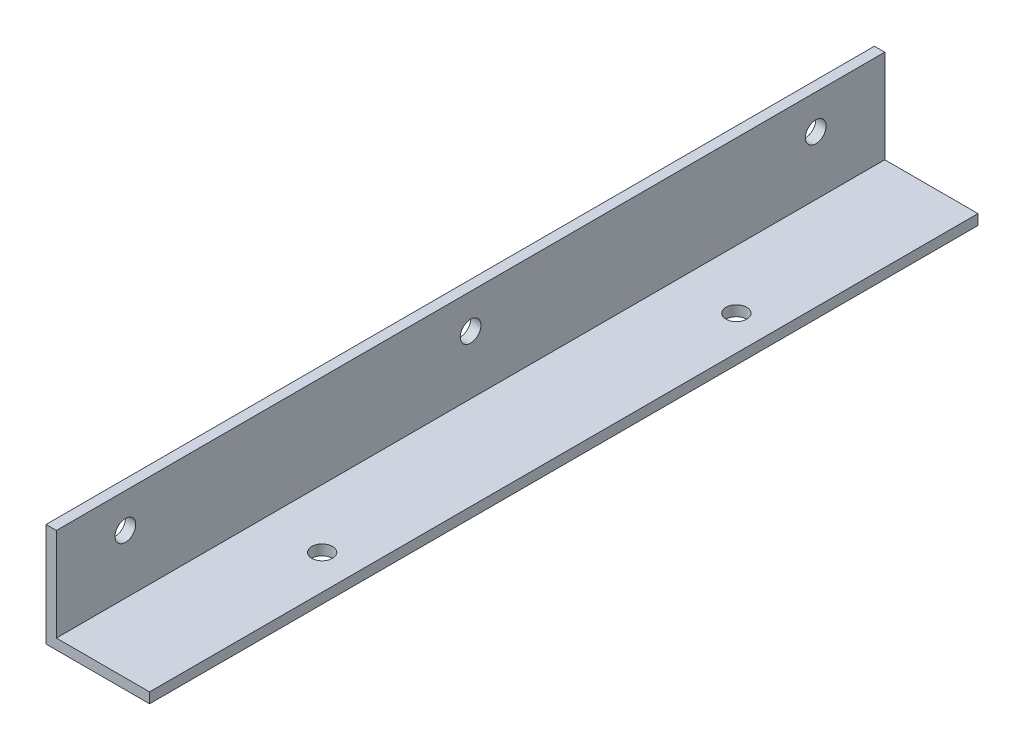
ISO-10303-21;
HEADER;
FILE_DESCRIPTION(('STEP AP214'),'2;1');
FILE_NAME('part.step','',(''),(''),'','','');
FILE_SCHEMA(('AUTOMOTIVE_DESIGN { 1 0 10303 214 1 1 1 1 }'));
ENDSEC;
DATA;
#1=APPLICATION_CONTEXT('core data for automotive mechanical design processes');
#2=APPLICATION_PROTOCOL_DEFINITION('international standard','automotive_design',2000,#1);
#3=PRODUCT_CONTEXT('',#1,'mechanical');
#4=PRODUCT('Part','Part','',(#3));
#5=PRODUCT_RELATED_PRODUCT_CATEGORY('part','',(#4));
#6=PRODUCT_DEFINITION_FORMATION('','',#4);
#7=PRODUCT_DEFINITION_CONTEXT('part definition',#1,'design');
#8=PRODUCT_DEFINITION('design','',#6,#7);
#9=PRODUCT_DEFINITION_SHAPE('','',#8);
#10=(LENGTH_UNIT() NAMED_UNIT(*) SI_UNIT(.MILLI.,.METRE.));
#11=(NAMED_UNIT(*) PLANE_ANGLE_UNIT() SI_UNIT($,.RADIAN.));
#12=(NAMED_UNIT(*) SI_UNIT($,.STERADIAN.) SOLID_ANGLE_UNIT());
#13=UNCERTAINTY_MEASURE_WITH_UNIT(LENGTH_MEASURE(1.E-05),#10,'distance_accuracy_value','');
#14=(GEOMETRIC_REPRESENTATION_CONTEXT(3) GLOBAL_UNCERTAINTY_ASSIGNED_CONTEXT((#13)) GLOBAL_UNIT_ASSIGNED_CONTEXT((#10,
#11,#12)) REPRESENTATION_CONTEXT('',''));
#15=CARTESIAN_POINT('',(0.,0.,0.));
#16=DIRECTION('',(0.,0.,1.));
#17=DIRECTION('',(1.,0.,0.));
#18=AXIS2_PLACEMENT_3D('',#15,#16,#17);
#19=CARTESIAN_POINT('',(0.,0.,120.));
#20=DIRECTION('',(1.,0.,0.));
#21=DIRECTION('',(0.,0.,-1.));
#22=AXIS2_PLACEMENT_3D('',#19,#20,#21);
#23=PLANE('',#22);
#24=CARTESIAN_POINT('',(0.,10.,110.));
#25=DIRECTION('',(-1.,0.,0.));
#26=DIRECTION('',(0.,0.,1.));
#27=AXIS2_PLACEMENT_3D('',#24,#25,#26);
#28=CIRCLE('',#27,1.5);
#29=CARTESIAN_POINT('',(0.,10.,111.5));
#30=VERTEX_POINT('',#29);
#31=EDGE_CURVE('E156',#30,#30,#28,.T.);
#32=ORIENTED_EDGE('',*,*,#31,.F.);
#33=EDGE_LOOP('',(#32));
#34=FACE_BOUND('',#33,.T.);
#35=CARTESIAN_POINT('',(0.,10.,9.99999999999999));
#36=DIRECTION('',(-1.,0.,0.));
#37=DIRECTION('',(0.,0.,1.));
#38=AXIS2_PLACEMENT_3D('',#35,#36,#37);
#39=CIRCLE('',#38,1.5);
#40=CARTESIAN_POINT('',(0.,10.,11.5));
#41=VERTEX_POINT('',#40);
#42=EDGE_CURVE('E146',#41,#41,#39,.T.);
#43=ORIENTED_EDGE('',*,*,#42,.F.);
#44=EDGE_LOOP('',(#43));
#45=FACE_BOUND('',#44,.T.);
#46=CARTESIAN_POINT('',(0.,10.,60.));
#47=DIRECTION('',(-1.,0.,0.));
#48=DIRECTION('',(0.,0.,1.));
#49=AXIS2_PLACEMENT_3D('',#46,#47,#48);
#50=CIRCLE('',#49,1.5);
#51=CARTESIAN_POINT('',(0.,10.,61.5));
#52=VERTEX_POINT('',#51);
#53=EDGE_CURVE('E136',#52,#52,#50,.T.);
#54=ORIENTED_EDGE('',*,*,#53,.F.);
#55=EDGE_LOOP('',(#54));
#56=FACE_BOUND('',#55,.T.);
#57=DIRECTION('',(0.,-1.,0.));
#58=VECTOR('',#57,1.);
#59=CARTESIAN_POINT('',(0.,0.,0.));
#60=LINE('',#59,#58);
#61=CARTESIAN_POINT('',(0.,15.,0.));
#62=VERTEX_POINT('',#61);
#63=CARTESIAN_POINT('',(0.,0.,0.));
#64=VERTEX_POINT('',#63);
#65=EDGE_CURVE('E117',#62,#64,#60,.T.);
#66=ORIENTED_EDGE('',*,*,#65,.T.);
#67=DIRECTION('',(0.,0.,-1.));
#68=VECTOR('',#67,1.);
#69=CARTESIAN_POINT('',(0.,0.,120.));
#70=LINE('',#69,#68);
#71=CARTESIAN_POINT('',(0.,0.,120.));
#72=VERTEX_POINT('',#71);
#73=EDGE_CURVE('E11',#72,#64,#70,.T.);
#74=ORIENTED_EDGE('',*,*,#73,.F.);
#75=DIRECTION('',(0.,-1.,0.));
#76=VECTOR('',#75,1.);
#77=CARTESIAN_POINT('',(0.,0.,120.));
#78=LINE('',#77,#76);
#79=CARTESIAN_POINT('',(0.,15.,120.));
#80=VERTEX_POINT('',#79);
#81=EDGE_CURVE('E128',#80,#72,#78,.T.);
#82=ORIENTED_EDGE('',*,*,#81,.F.);
#83=DIRECTION('',(0.,0.,-1.));
#84=VECTOR('',#83,1.);
#85=CARTESIAN_POINT('',(0.,15.,120.));
#86=LINE('',#85,#84);
#87=EDGE_CURVE('E113',#80,#62,#86,.T.);
#88=ORIENTED_EDGE('',*,*,#87,.T.);
#89=EDGE_LOOP('',(#66,#74,#82,#88));
#90=FACE_BOUND('',#89,.T.);
#91=ADVANCED_FACE('F31',(#34,#45,#56,#90),#23,.F.);
#92=CARTESIAN_POINT('',(1.5,0.,120.));
#93=DIRECTION('',(0.,1.,0.));
#94=DIRECTION('',(0.,0.,1.));
#95=AXIS2_PLACEMENT_3D('',#92,#93,#94);
#96=PLANE('',#95);
#97=CARTESIAN_POINT('',(10.,0.,30.));
#98=DIRECTION('',(0.,-1.,0.));
#99=DIRECTION('',(0.,0.,-1.));
#100=AXIS2_PLACEMENT_3D('',#97,#98,#99);
#101=CIRCLE('',#100,1.5);
#102=CARTESIAN_POINT('',(10.,0.,28.5));
#103=VERTEX_POINT('',#102);
#104=EDGE_CURVE('E143',#103,#103,#101,.T.);
#105=ORIENTED_EDGE('',*,*,#104,.F.);
#106=EDGE_LOOP('',(#105));
#107=FACE_BOUND('',#106,.T.);
#108=CARTESIAN_POINT('',(10.,0.,90.));
#109=DIRECTION('',(0.,-1.,0.));
#110=DIRECTION('',(0.,0.,-1.));
#111=AXIS2_PLACEMENT_3D('',#108,#109,#110);
#112=CIRCLE('',#111,1.5);
#113=CARTESIAN_POINT('',(10.,0.,88.5));
#114=VERTEX_POINT('',#113);
#115=EDGE_CURVE('E140',#114,#114,#112,.T.);
#116=ORIENTED_EDGE('',*,*,#115,.F.);
#117=EDGE_LOOP('',(#116));
#118=FACE_BOUND('',#117,.T.);
#119=DIRECTION('',(1.,0.,0.));
#120=VECTOR('',#119,1.);
#121=CARTESIAN_POINT('',(1.5,0.,0.));
#122=LINE('',#121,#120);
#123=CARTESIAN_POINT('',(15.,0.,0.));
#124=VERTEX_POINT('',#123);
#125=EDGE_CURVE('E120',#64,#124,#122,.T.);
#126=ORIENTED_EDGE('',*,*,#125,.T.);
#127=DIRECTION('',(0.,0.,-1.));
#128=VECTOR('',#127,1.);
#129=CARTESIAN_POINT('',(15.,0.,120.));
#130=LINE('',#129,#128);
#131=CARTESIAN_POINT('',(15.,0.,120.));
#132=VERTEX_POINT('',#131);
#133=EDGE_CURVE('E40',#132,#124,#130,.T.);
#134=ORIENTED_EDGE('',*,*,#133,.F.);
#135=DIRECTION('',(1.,0.,0.));
#136=VECTOR('',#135,1.);
#137=CARTESIAN_POINT('',(0.,0.,120.));
#138=LINE('',#137,#136);
#139=EDGE_CURVE('E86',#72,#132,#138,.T.);
#140=ORIENTED_EDGE('',*,*,#139,.F.);
#141=ORIENTED_EDGE('',*,*,#73,.T.);
#142=EDGE_LOOP('',(#126,#134,#140,#141));
#143=FACE_BOUND('',#142,.T.);
#144=ADVANCED_FACE('F166',(#107,#118,#143),#96,.F.);
#145=CARTESIAN_POINT('',(15.,0.,120.));
#146=DIRECTION('',(-1.,0.,0.));
#147=DIRECTION('',(0.,0.,1.));
#148=AXIS2_PLACEMENT_3D('',#145,#146,#147);
#149=PLANE('',#148);
#150=DIRECTION('',(0.,1.,0.));
#151=VECTOR('',#150,1.);
#152=CARTESIAN_POINT('',(15.,0.,0.));
#153=LINE('',#152,#151);
#154=CARTESIAN_POINT('',(15.,1.5,0.));
#155=VERTEX_POINT('',#154);
#156=EDGE_CURVE('E123',#124,#155,#153,.T.);
#157=ORIENTED_EDGE('',*,*,#156,.T.);
#158=DIRECTION('',(0.,0.,-1.));
#159=VECTOR('',#158,1.);
#160=CARTESIAN_POINT('',(15.,1.5,120.));
#161=LINE('',#160,#159);
#162=CARTESIAN_POINT('',(15.,1.5,120.));
#163=VERTEX_POINT('',#162);
#164=EDGE_CURVE('E108',#163,#155,#161,.T.);
#165=ORIENTED_EDGE('',*,*,#164,.F.);
#166=DIRECTION('',(0.,1.,0.));
#167=VECTOR('',#166,1.);
#168=CARTESIAN_POINT('',(15.,0.,120.));
#169=LINE('',#168,#167);
#170=EDGE_CURVE('E99',#132,#163,#169,.T.);
#171=ORIENTED_EDGE('',*,*,#170,.F.);
#172=ORIENTED_EDGE('',*,*,#133,.T.);
#173=EDGE_LOOP('',(#157,#165,#171,#172));
#174=FACE_BOUND('',#173,.T.);
#175=ADVANCED_FACE('F169',(#174),#149,.F.);
#176=CARTESIAN_POINT('',(1.5,1.5,120.));
#177=DIRECTION('',(0.,-1.,0.));
#178=DIRECTION('',(0.,0.,-1.));
#179=AXIS2_PLACEMENT_3D('',#176,#177,#178);
#180=PLANE('',#179);
#181=CARTESIAN_POINT('',(10.,1.5,30.));
#182=DIRECTION('',(0.,-1.,0.));
#183=DIRECTION('',(0.,0.,-1.));
#184=AXIS2_PLACEMENT_3D('',#181,#182,#183);
#185=CIRCLE('',#184,1.5);
#186=CARTESIAN_POINT('',(10.,1.5,28.5));
#187=VERTEX_POINT('',#186);
#188=EDGE_CURVE('E141',#187,#187,#185,.T.);
#189=ORIENTED_EDGE('',*,*,#188,.T.);
#190=EDGE_LOOP('',(#189));
#191=FACE_BOUND('',#190,.T.);
#192=CARTESIAN_POINT('',(10.,1.5,90.));
#193=DIRECTION('',(0.,-1.,0.));
#194=DIRECTION('',(0.,0.,-1.));
#195=AXIS2_PLACEMENT_3D('',#192,#193,#194);
#196=CIRCLE('',#195,1.5);
#197=CARTESIAN_POINT('',(10.,1.5,88.5));
#198=VERTEX_POINT('',#197);
#199=EDGE_CURVE('E137',#198,#198,#196,.T.);
#200=ORIENTED_EDGE('',*,*,#199,.T.);
#201=EDGE_LOOP('',(#200));
#202=FACE_BOUND('',#201,.T.);
#203=DIRECTION('',(-1.,0.,0.));
#204=VECTOR('',#203,1.);
#205=CARTESIAN_POINT('',(1.5,1.5,0.));
#206=LINE('',#205,#204);
#207=CARTESIAN_POINT('',(1.5,1.5,0.));
#208=VERTEX_POINT('',#207);
#209=EDGE_CURVE('E107',#155,#208,#206,.T.);
#210=ORIENTED_EDGE('',*,*,#209,.T.);
#211=DIRECTION('',(0.,0.,-1.));
#212=VECTOR('',#211,1.);
#213=CARTESIAN_POINT('',(1.5,1.5,120.));
#214=LINE('',#213,#212);
#215=CARTESIAN_POINT('',(1.5,1.5,120.));
#216=VERTEX_POINT('',#215);
#217=EDGE_CURVE('E104',#216,#208,#214,.T.);
#218=ORIENTED_EDGE('',*,*,#217,.F.);
#219=DIRECTION('',(-1.,0.,0.));
#220=VECTOR('',#219,1.);
#221=CARTESIAN_POINT('',(1.5,1.5,120.));
#222=LINE('',#221,#220);
#223=EDGE_CURVE('E93',#163,#216,#222,.T.);
#224=ORIENTED_EDGE('',*,*,#223,.F.);
#225=ORIENTED_EDGE('',*,*,#164,.T.);
#226=EDGE_LOOP('',(#210,#218,#224,#225));
#227=FACE_BOUND('',#226,.T.);
#228=ADVANCED_FACE('F105',(#191,#202,#227),#180,.F.);
#229=CARTESIAN_POINT('',(1.5,1.5,120.));
#230=DIRECTION('',(-1.,0.,0.));
#231=DIRECTION('',(0.,0.,1.));
#232=AXIS2_PLACEMENT_3D('',#229,#230,#231);
#233=PLANE('',#232);
#234=CARTESIAN_POINT('',(1.5,10.,110.));
#235=DIRECTION('',(-1.,0.,0.));
#236=DIRECTION('',(0.,0.,1.));
#237=AXIS2_PLACEMENT_3D('',#234,#235,#236);
#238=CIRCLE('',#237,1.5);
#239=CARTESIAN_POINT('',(1.5,10.,111.5));
#240=VERTEX_POINT('',#239);
#241=EDGE_CURVE('E34',#240,#240,#238,.T.);
#242=ORIENTED_EDGE('',*,*,#241,.T.);
#243=EDGE_LOOP('',(#242));
#244=FACE_BOUND('',#243,.T.);
#245=CARTESIAN_POINT('',(1.5,10.,9.99999999999999));
#246=DIRECTION('',(-1.,0.,0.));
#247=DIRECTION('',(0.,0.,1.));
#248=AXIS2_PLACEMENT_3D('',#245,#246,#247);
#249=CIRCLE('',#248,1.5);
#250=CARTESIAN_POINT('',(1.5,10.,11.5));
#251=VERTEX_POINT('',#250);
#252=EDGE_CURVE('E144',#251,#251,#249,.T.);
#253=ORIENTED_EDGE('',*,*,#252,.T.);
#254=EDGE_LOOP('',(#253));
#255=FACE_BOUND('',#254,.T.);
#256=CARTESIAN_POINT('',(1.5,10.,60.));
#257=DIRECTION('',(-1.,0.,0.));
#258=DIRECTION('',(0.,0.,1.));
#259=AXIS2_PLACEMENT_3D('',#256,#257,#258);
#260=CIRCLE('',#259,1.5);
#261=CARTESIAN_POINT('',(1.5,10.,61.5));
#262=VERTEX_POINT('',#261);
#263=EDGE_CURVE('E121',#262,#262,#260,.T.);
#264=ORIENTED_EDGE('',*,*,#263,.T.);
#265=EDGE_LOOP('',(#264));
#266=FACE_BOUND('',#265,.T.);
#267=DIRECTION('',(0.,1.,0.));
#268=VECTOR('',#267,1.);
#269=CARTESIAN_POINT('',(1.5,1.5,0.));
#270=LINE('',#269,#268);
#271=CARTESIAN_POINT('',(1.5,15.,0.));
#272=VERTEX_POINT('',#271);
#273=EDGE_CURVE('E72',#208,#272,#270,.T.);
#274=ORIENTED_EDGE('',*,*,#273,.T.);
#275=DIRECTION('',(0.,0.,-1.));
#276=VECTOR('',#275,1.);
#277=CARTESIAN_POINT('',(1.5,15.,120.));
#278=LINE('',#277,#276);
#279=CARTESIAN_POINT('',(1.5,15.,120.));
#280=VERTEX_POINT('',#279);
#281=EDGE_CURVE('E109',#280,#272,#278,.T.);
#282=ORIENTED_EDGE('',*,*,#281,.F.);
#283=DIRECTION('',(0.,1.,0.));
#284=VECTOR('',#283,1.);
#285=CARTESIAN_POINT('',(1.5,1.5,120.));
#286=LINE('',#285,#284);
#287=EDGE_CURVE('E97',#216,#280,#286,.T.);
#288=ORIENTED_EDGE('',*,*,#287,.F.);
#289=ORIENTED_EDGE('',*,*,#217,.T.);
#290=EDGE_LOOP('',(#274,#282,#288,#289));
#291=FACE_BOUND('',#290,.T.);
#292=ADVANCED_FACE('F111',(#244,#255,#266,#291),#233,.F.);
#293=CARTESIAN_POINT('',(0.,15.,120.));
#294=DIRECTION('',(0.,-1.,0.));
#295=DIRECTION('',(0.,0.,-1.));
#296=AXIS2_PLACEMENT_3D('',#293,#294,#295);
#297=PLANE('',#296);
#298=DIRECTION('',(-1.,0.,0.));
#299=VECTOR('',#298,1.);
#300=CARTESIAN_POINT('',(0.,15.,0.));
#301=LINE('',#300,#299);
#302=EDGE_CURVE('E78',#272,#62,#301,.T.);
#303=ORIENTED_EDGE('',*,*,#302,.T.);
#304=ORIENTED_EDGE('',*,*,#87,.F.);
#305=DIRECTION('',(-1.,0.,0.));
#306=VECTOR('',#305,1.);
#307=CARTESIAN_POINT('',(0.,15.,120.));
#308=LINE('',#307,#306);
#309=EDGE_CURVE('E49',#280,#80,#308,.T.);
#310=ORIENTED_EDGE('',*,*,#309,.F.);
#311=ORIENTED_EDGE('',*,*,#281,.T.);
#312=EDGE_LOOP('',(#303,#304,#310,#311));
#313=FACE_BOUND('',#312,.T.);
#314=ADVANCED_FACE('F174',(#313),#297,.F.);
#315=CARTESIAN_POINT('',(0.,15.,120.));
#316=DIRECTION('',(0.,0.,-1.));
#317=DIRECTION('',(-1.,0.,0.));
#318=AXIS2_PLACEMENT_3D('',#315,#316,#317);
#319=PLANE('',#318);
#320=ORIENTED_EDGE('',*,*,#81,.T.);
#321=ORIENTED_EDGE('',*,*,#139,.T.);
#322=ORIENTED_EDGE('',*,*,#170,.T.);
#323=ORIENTED_EDGE('',*,*,#223,.T.);
#324=ORIENTED_EDGE('',*,*,#287,.T.);
#325=ORIENTED_EDGE('',*,*,#309,.T.);
#326=EDGE_LOOP('',(#320,#321,#322,#323,#324,#325));
#327=FACE_BOUND('',#326,.T.);
#328=ADVANCED_FACE('F95',(#327),#319,.F.);
#329=CARTESIAN_POINT('',(0.,15.,0.));
#330=DIRECTION('',(0.,0.,-1.));
#331=DIRECTION('',(-1.,0.,0.));
#332=AXIS2_PLACEMENT_3D('',#329,#330,#331);
#333=PLANE('',#332);
#334=ORIENTED_EDGE('',*,*,#65,.F.);
#335=ORIENTED_EDGE('',*,*,#302,.F.);
#336=ORIENTED_EDGE('',*,*,#273,.F.);
#337=ORIENTED_EDGE('',*,*,#209,.F.);
#338=ORIENTED_EDGE('',*,*,#156,.F.);
#339=ORIENTED_EDGE('',*,*,#125,.F.);
#340=EDGE_LOOP('',(#334,#335,#336,#337,#338,#339));
#341=FACE_BOUND('',#340,.T.);
#342=ADVANCED_FACE('F172',(#341),#333,.T.);
#343=CARTESIAN_POINT('',(15.,10.,60.));
#344=DIRECTION('',(-1.,0.,0.));
#345=DIRECTION('',(0.,0.,1.));
#346=AXIS2_PLACEMENT_3D('',#343,#344,#345);
#347=CYLINDRICAL_SURFACE('',#346,1.5);
#348=ORIENTED_EDGE('',*,*,#53,.T.);
#349=EDGE_LOOP('',(#348));
#350=FACE_BOUND('',#349,.T.);
#351=ORIENTED_EDGE('',*,*,#263,.F.);
#352=EDGE_LOOP('',(#351));
#353=FACE_BOUND('',#352,.T.);
#354=ADVANCED_FACE('F197',(#350,#353),#347,.F.);
#355=CARTESIAN_POINT('',(10.,120.,90.));
#356=DIRECTION('',(0.,-1.,0.));
#357=DIRECTION('',(0.,0.,-1.));
#358=AXIS2_PLACEMENT_3D('',#355,#356,#357);
#359=CYLINDRICAL_SURFACE('',#358,1.5);
#360=ORIENTED_EDGE('',*,*,#115,.T.);
#361=EDGE_LOOP('',(#360));
#362=FACE_BOUND('',#361,.T.);
#363=ORIENTED_EDGE('',*,*,#199,.F.);
#364=EDGE_LOOP('',(#363));
#365=FACE_BOUND('',#364,.T.);
#366=ADVANCED_FACE('F200',(#362,#365),#359,.F.);
#367=CARTESIAN_POINT('',(10.,120.,30.));
#368=DIRECTION('',(0.,-1.,0.));
#369=DIRECTION('',(0.,0.,-1.));
#370=AXIS2_PLACEMENT_3D('',#367,#368,#369);
#371=CYLINDRICAL_SURFACE('',#370,1.5);
#372=ORIENTED_EDGE('',*,*,#104,.T.);
#373=EDGE_LOOP('',(#372));
#374=FACE_BOUND('',#373,.T.);
#375=ORIENTED_EDGE('',*,*,#188,.F.);
#376=EDGE_LOOP('',(#375));
#377=FACE_BOUND('',#376,.T.);
#378=ADVANCED_FACE('F208',(#374,#377),#371,.F.);
#379=CARTESIAN_POINT('',(15.,10.,9.99999999999999));
#380=DIRECTION('',(-1.,0.,0.));
#381=DIRECTION('',(0.,0.,1.));
#382=AXIS2_PLACEMENT_3D('',#379,#380,#381);
#383=CYLINDRICAL_SURFACE('',#382,1.5);
#384=ORIENTED_EDGE('',*,*,#42,.T.);
#385=EDGE_LOOP('',(#384));
#386=FACE_BOUND('',#385,.T.);
#387=ORIENTED_EDGE('',*,*,#252,.F.);
#388=EDGE_LOOP('',(#387));
#389=FACE_BOUND('',#388,.T.);
#390=ADVANCED_FACE('F214',(#386,#389),#383,.F.);
#391=CARTESIAN_POINT('',(15.,10.,110.));
#392=DIRECTION('',(-1.,0.,0.));
#393=DIRECTION('',(0.,0.,1.));
#394=AXIS2_PLACEMENT_3D('',#391,#392,#393);
#395=CYLINDRICAL_SURFACE('',#394,1.5);
#396=ORIENTED_EDGE('',*,*,#31,.T.);
#397=EDGE_LOOP('',(#396));
#398=FACE_BOUND('',#397,.T.);
#399=ORIENTED_EDGE('',*,*,#241,.F.);
#400=EDGE_LOOP('',(#399));
#401=FACE_BOUND('',#400,.T.);
#402=ADVANCED_FACE('F218',(#398,#401),#395,.F.);
#403=CLOSED_SHELL('',(#91,#144,#175,#228,#292,#314,#328,#342,#354,#366,#378,#390,#402));
#404=MANIFOLD_SOLID_BREP('B2',#403);
#405=ADVANCED_BREP_SHAPE_REPRESENTATION('',(#18,#404),#14);
#406=SHAPE_DEFINITION_REPRESENTATION(#9,#405);
ENDSEC;
END-ISO-10303-21;
